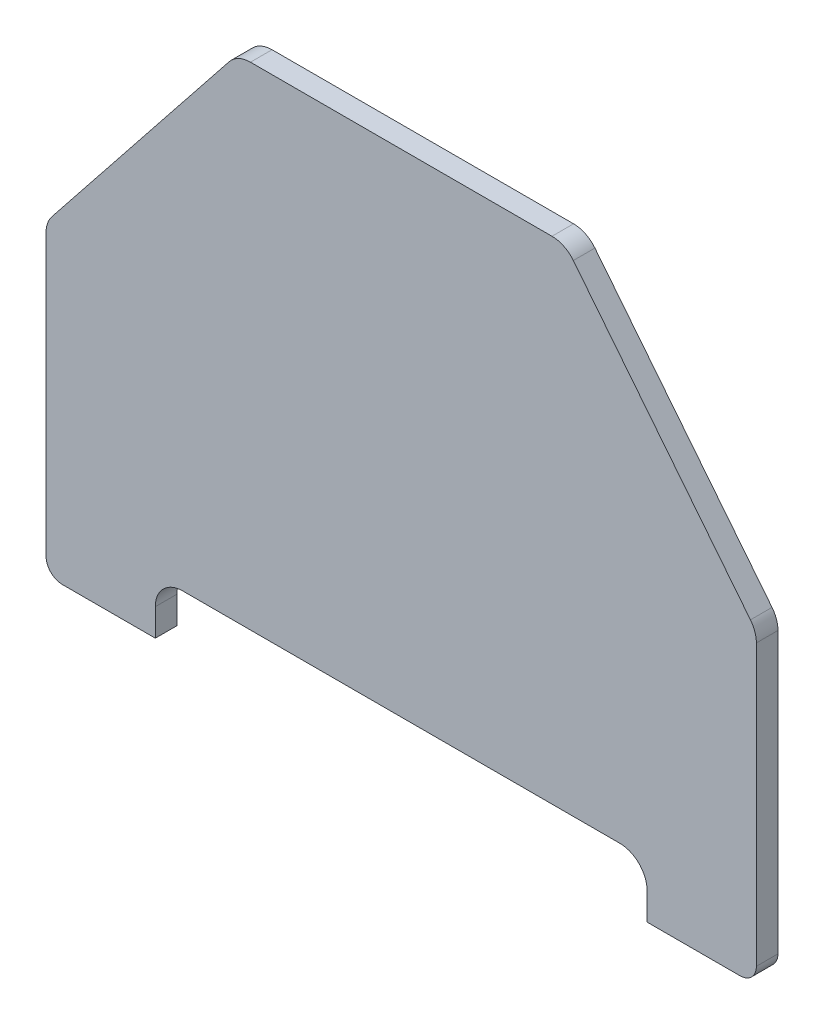
ISO-10303-21;
HEADER;
FILE_DESCRIPTION(('STEP AP214'),'2;1');
FILE_NAME('part.step','',(''),(''),'','','');
FILE_SCHEMA(('AUTOMOTIVE_DESIGN { 1 0 10303 214 1 1 1 1 }'));
ENDSEC;
DATA;
#1=APPLICATION_CONTEXT('core data for automotive mechanical design processes');
#2=APPLICATION_PROTOCOL_DEFINITION('international standard','automotive_design',2000,#1);
#3=PRODUCT_CONTEXT('',#1,'mechanical');
#4=PRODUCT('Part','Part','',(#3));
#5=PRODUCT_RELATED_PRODUCT_CATEGORY('part','',(#4));
#6=PRODUCT_DEFINITION_FORMATION('','',#4);
#7=PRODUCT_DEFINITION_CONTEXT('part definition',#1,'design');
#8=PRODUCT_DEFINITION('design','',#6,#7);
#9=PRODUCT_DEFINITION_SHAPE('','',#8);
#10=(LENGTH_UNIT() NAMED_UNIT(*) SI_UNIT(.MILLI.,.METRE.));
#11=(NAMED_UNIT(*) PLANE_ANGLE_UNIT() SI_UNIT($,.RADIAN.));
#12=(NAMED_UNIT(*) SI_UNIT($,.STERADIAN.) SOLID_ANGLE_UNIT());
#13=UNCERTAINTY_MEASURE_WITH_UNIT(LENGTH_MEASURE(1.E-05),#10,'distance_accuracy_value','');
#14=(GEOMETRIC_REPRESENTATION_CONTEXT(3) GLOBAL_UNCERTAINTY_ASSIGNED_CONTEXT((#13)) GLOBAL_UNIT_ASSIGNED_CONTEXT((#10,
#11,#12)) REPRESENTATION_CONTEXT('',''));
#15=CARTESIAN_POINT('',(0.,0.,0.));
#16=DIRECTION('',(0.,0.,1.));
#17=DIRECTION('',(1.,0.,0.));
#18=AXIS2_PLACEMENT_3D('',#15,#16,#17);
#19=CARTESIAN_POINT('',(110.,0.,3.95));
#20=DIRECTION('',(0.,1.,0.));
#21=DIRECTION('',(0.,0.,1.));
#22=AXIS2_PLACEMENT_3D('',#19,#20,#21);
#23=PLANE('',#22);
#24=DIRECTION('',(1.,0.,0.));
#25=VECTOR('',#24,1.);
#26=CARTESIAN_POINT('',(110.,0.,0.));
#27=LINE('',#26,#25);
#28=CARTESIAN_POINT('',(110.,0.,0.));
#29=VERTEX_POINT('',#28);
#30=CARTESIAN_POINT('',(127.,0.,0.));
#31=VERTEX_POINT('',#30);
#32=EDGE_CURVE('E194',#29,#31,#27,.T.);
#33=ORIENTED_EDGE('',*,*,#32,.T.);
#34=DIRECTION('',(0.,0.,-1.));
#35=VECTOR('',#34,1.);
#36=CARTESIAN_POINT('',(127.,0.,3.95));
#37=LINE('',#36,#35);
#38=CARTESIAN_POINT('',(127.,0.,3.95));
#39=VERTEX_POINT('',#38);
#40=EDGE_CURVE('E282',#31,#39,#37,.F.);
#41=ORIENTED_EDGE('',*,*,#40,.T.);
#42=DIRECTION('',(1.,0.,0.));
#43=VECTOR('',#42,1.);
#44=CARTESIAN_POINT('',(110.,0.,3.95));
#45=LINE('',#44,#43);
#46=CARTESIAN_POINT('',(110.,0.,3.95));
#47=VERTEX_POINT('',#46);
#48=EDGE_CURVE('E218',#47,#39,#45,.T.);
#49=ORIENTED_EDGE('',*,*,#48,.F.);
#50=DIRECTION('',(0.,0.,-1.));
#51=VECTOR('',#50,1.);
#52=CARTESIAN_POINT('',(110.,0.,3.95));
#53=LINE('',#52,#51);
#54=EDGE_CURVE('E181',#47,#29,#53,.T.);
#55=ORIENTED_EDGE('',*,*,#54,.T.);
#56=EDGE_LOOP('',(#33,#41,#49,#55));
#57=FACE_BOUND('',#56,.T.);
#58=ADVANCED_FACE('F37',(#57),#23,.F.);
#59=CARTESIAN_POINT('',(130.,56.,3.95));
#60=DIRECTION('',(-1.,0.,0.));
#61=DIRECTION('',(0.,0.,1.));
#62=AXIS2_PLACEMENT_3D('',#59,#60,#61);
#63=PLANE('',#62);
#64=DIRECTION('',(0.,1.,0.));
#65=VECTOR('',#64,1.);
#66=CARTESIAN_POINT('',(130.,56.,3.95));
#67=LINE('',#66,#65);
#68=CARTESIAN_POINT('',(130.,3.,3.95));
#69=VERTEX_POINT('',#68);
#70=CARTESIAN_POINT('',(130.,54.2538898303597,3.95));
#71=VERTEX_POINT('',#70);
#72=EDGE_CURVE('E313',#69,#71,#67,.T.);
#73=ORIENTED_EDGE('',*,*,#72,.F.);
#74=DIRECTION('',(0.,0.,-1.));
#75=VECTOR('',#74,1.);
#76=CARTESIAN_POINT('',(130.,3.,3.95));
#77=LINE('',#76,#75);
#78=CARTESIAN_POINT('',(130.,3.,0.));
#79=VERTEX_POINT('',#78);
#80=EDGE_CURVE('E275',#69,#79,#77,.T.);
#81=ORIENTED_EDGE('',*,*,#80,.T.);
#82=DIRECTION('',(0.,1.,0.));
#83=VECTOR('',#82,1.);
#84=CARTESIAN_POINT('',(130.,56.,0.));
#85=LINE('',#84,#83);
#86=CARTESIAN_POINT('',(130.,54.2538898303597,0.));
#87=VERTEX_POINT('',#86);
#88=EDGE_CURVE('E197',#79,#87,#85,.T.);
#89=ORIENTED_EDGE('',*,*,#88,.T.);
#90=DIRECTION('',(0.,0.,-1.));
#91=VECTOR('',#90,1.);
#92=CARTESIAN_POINT('',(130.,54.2538898303597,3.95));
#93=LINE('',#92,#91);
#94=EDGE_CURVE('E234',#87,#71,#93,.F.);
#95=ORIENTED_EDGE('',*,*,#94,.T.);
#96=EDGE_LOOP('',(#73,#81,#89,#95));
#97=FACE_BOUND('',#96,.T.);
#98=ADVANCED_FACE('F334',(#97),#63,.F.);
#99=CARTESIAN_POINT('',(95.,100.,3.95));
#100=DIRECTION('',(-0.782601054175649,-0.622523565821539,0.));
#101=DIRECTION('',(0.622523565821539,-0.782601054175649,0.));
#102=AXIS2_PLACEMENT_3D('',#99,#100,#101);
#103=PLANE('',#102);
#104=DIRECTION('',(-0.622523565821539,0.782601054175649,0.));
#105=VECTOR('',#104,1.);
#106=CARTESIAN_POINT('',(95.,100.,3.95));
#107=LINE('',#106,#105);
#108=CARTESIAN_POINT('',(128.913005270878,57.3665076594673,3.95));
#109=VERTEX_POINT('',#108);
#110=CARTESIAN_POINT('',(96.5013267268461,98.1126178291077,3.95));
#111=VERTEX_POINT('',#110);
#112=EDGE_CURVE('E315',#109,#111,#107,.T.);
#113=ORIENTED_EDGE('',*,*,#112,.F.);
#114=DIRECTION('',(0.,0.,-1.));
#115=VECTOR('',#114,1.);
#116=CARTESIAN_POINT('',(128.913005270878,57.3665076594673,3.95));
#117=LINE('',#116,#115);
#118=CARTESIAN_POINT('',(128.913005270878,57.3665076594673,0.));
#119=VERTEX_POINT('',#118);
#120=EDGE_CURVE('E222',#109,#119,#117,.T.);
#121=ORIENTED_EDGE('',*,*,#120,.T.);
#122=DIRECTION('',(-0.622523565821539,0.782601054175649,0.));
#123=VECTOR('',#122,1.);
#124=CARTESIAN_POINT('',(95.,100.,0.));
#125=LINE('',#124,#123);
#126=CARTESIAN_POINT('',(96.5013267268461,98.1126178291077,0.));
#127=VERTEX_POINT('',#126);
#128=EDGE_CURVE('E199',#119,#127,#125,.T.);
#129=ORIENTED_EDGE('',*,*,#128,.T.);
#130=DIRECTION('',(0.,0.,-1.));
#131=VECTOR('',#130,1.);
#132=CARTESIAN_POINT('',(96.5013267268461,98.1126178291077,3.95));
#133=LINE('',#132,#131);
#134=EDGE_CURVE('E180',#127,#111,#133,.F.);
#135=ORIENTED_EDGE('',*,*,#134,.T.);
#136=EDGE_LOOP('',(#113,#121,#129,#135));
#137=FACE_BOUND('',#136,.T.);
#138=ADVANCED_FACE('F339',(#137),#103,.F.);
#139=CARTESIAN_POINT('',(35.,100.,3.95));
#140=DIRECTION('',(0.,-1.,0.));
#141=DIRECTION('',(0.,0.,-1.));
#142=AXIS2_PLACEMENT_3D('',#139,#140,#141);
#143=PLANE('',#142);
#144=DIRECTION('',(-1.,0.,0.));
#145=VECTOR('',#144,1.);
#146=CARTESIAN_POINT('',(35.,100.,3.95));
#147=LINE('',#146,#145);
#148=CARTESIAN_POINT('',(92.5883214559679,100.,3.95));
#149=VERTEX_POINT('',#148);
#150=CARTESIAN_POINT('',(37.4116785440321,100.,3.95));
#151=VERTEX_POINT('',#150);
#152=EDGE_CURVE('E320',#149,#151,#147,.T.);
#153=ORIENTED_EDGE('',*,*,#152,.F.);
#154=DIRECTION('',(0.,0.,-1.));
#155=VECTOR('',#154,1.);
#156=CARTESIAN_POINT('',(92.5883214559679,100.,3.95));
#157=LINE('',#156,#155);
#158=CARTESIAN_POINT('',(92.5883214559679,100.,0.));
#159=VERTEX_POINT('',#158);
#160=EDGE_CURVE('E247',#149,#159,#157,.T.);
#161=ORIENTED_EDGE('',*,*,#160,.T.);
#162=DIRECTION('',(-1.,0.,0.));
#163=VECTOR('',#162,1.);
#164=CARTESIAN_POINT('',(35.,100.,0.));
#165=LINE('',#164,#163);
#166=CARTESIAN_POINT('',(37.4116785440321,100.,0.));
#167=VERTEX_POINT('',#166);
#168=EDGE_CURVE('E202',#159,#167,#165,.T.);
#169=ORIENTED_EDGE('',*,*,#168,.T.);
#170=DIRECTION('',(0.,0.,-1.));
#171=VECTOR('',#170,1.);
#172=CARTESIAN_POINT('',(37.4116785440321,100.,3.95));
#173=LINE('',#172,#171);
#174=EDGE_CURVE('E245',#167,#151,#173,.F.);
#175=ORIENTED_EDGE('',*,*,#174,.T.);
#176=EDGE_LOOP('',(#153,#161,#169,#175));
#177=FACE_BOUND('',#176,.T.);
#178=ADVANCED_FACE('F435',(#177),#143,.F.);
#179=CARTESIAN_POINT('',(0.,56.,3.95));
#180=DIRECTION('',(0.782601054175649,-0.622523565821539,0.));
#181=DIRECTION('',(0.622523565821539,0.782601054175649,0.));
#182=AXIS2_PLACEMENT_3D('',#179,#180,#181);
#183=PLANE('',#182);
#184=DIRECTION('',(-0.622523565821539,-0.782601054175649,0.));
#185=VECTOR('',#184,1.);
#186=CARTESIAN_POINT('',(0.,56.,3.95));
#187=LINE('',#186,#185);
#188=CARTESIAN_POINT('',(33.4986732731538,98.1126178291077,3.95));
#189=VERTEX_POINT('',#188);
#190=CARTESIAN_POINT('',(1.08699472912176,57.3665076594674,3.95));
#191=VERTEX_POINT('',#190);
#192=EDGE_CURVE('E323',#189,#191,#187,.T.);
#193=ORIENTED_EDGE('',*,*,#192,.F.);
#194=DIRECTION('',(0.,0.,-1.));
#195=VECTOR('',#194,1.);
#196=CARTESIAN_POINT('',(33.4986732731538,98.1126178291077,3.95));
#197=LINE('',#196,#195);
#198=CARTESIAN_POINT('',(33.4986732731538,98.1126178291077,0.));
#199=VERTEX_POINT('',#198);
#200=EDGE_CURVE('E252',#189,#199,#197,.T.);
#201=ORIENTED_EDGE('',*,*,#200,.T.);
#202=DIRECTION('',(-0.622523565821539,-0.782601054175649,0.));
#203=VECTOR('',#202,1.);
#204=CARTESIAN_POINT('',(0.,56.,0.));
#205=LINE('',#204,#203);
#206=CARTESIAN_POINT('',(1.08699472912176,57.3665076594674,0.));
#207=VERTEX_POINT('',#206);
#208=EDGE_CURVE('E205',#199,#207,#205,.T.);
#209=ORIENTED_EDGE('',*,*,#208,.T.);
#210=DIRECTION('',(0.,0.,-1.));
#211=VECTOR('',#210,1.);
#212=CARTESIAN_POINT('',(1.08699472912176,57.3665076594674,3.95));
#213=LINE('',#212,#211);
#214=EDGE_CURVE('E250',#207,#191,#213,.F.);
#215=ORIENTED_EDGE('',*,*,#214,.T.);
#216=EDGE_LOOP('',(#193,#201,#209,#215));
#217=FACE_BOUND('',#216,.T.);
#218=ADVANCED_FACE('F414',(#217),#183,.F.);
#219=CARTESIAN_POINT('',(0.,56.,3.95));
#220=DIRECTION('',(1.,0.,0.));
#221=DIRECTION('',(0.,1.,0.));
#222=AXIS2_PLACEMENT_3D('',#219,#220,#221);
#223=PLANE('',#222);
#224=DIRECTION('',(0.,-1.,0.));
#225=VECTOR('',#224,1.);
#226=CARTESIAN_POINT('',(0.,56.,0.));
#227=LINE('',#226,#225);
#228=CARTESIAN_POINT('',(0.,54.2538898303597,0.));
#229=VERTEX_POINT('',#228);
#230=CARTESIAN_POINT('',(0.,3.,0.));
#231=VERTEX_POINT('',#230);
#232=EDGE_CURVE('E208',#229,#231,#227,.T.);
#233=ORIENTED_EDGE('',*,*,#232,.T.);
#234=DIRECTION('',(0.,0.,-1.));
#235=VECTOR('',#234,1.);
#236=CARTESIAN_POINT('',(0.,3.,3.95));
#237=LINE('',#236,#235);
#238=CARTESIAN_POINT('',(0.,3.,3.95));
#239=VERTEX_POINT('',#238);
#240=EDGE_CURVE('E11',#231,#239,#237,.F.);
#241=ORIENTED_EDGE('',*,*,#240,.T.);
#242=DIRECTION('',(0.,-1.,0.));
#243=VECTOR('',#242,1.);
#244=CARTESIAN_POINT('',(0.,56.,3.95));
#245=LINE('',#244,#243);
#246=CARTESIAN_POINT('',(0.,54.2538898303597,3.95));
#247=VERTEX_POINT('',#246);
#248=EDGE_CURVE('E170',#247,#239,#245,.T.);
#249=ORIENTED_EDGE('',*,*,#248,.F.);
#250=DIRECTION('',(0.,0.,-1.));
#251=VECTOR('',#250,1.);
#252=CARTESIAN_POINT('',(0.,54.2538898303597,3.95));
#253=LINE('',#252,#251);
#254=EDGE_CURVE('E255',#247,#229,#253,.T.);
#255=ORIENTED_EDGE('',*,*,#254,.T.);
#256=EDGE_LOOP('',(#233,#241,#249,#255));
#257=FACE_BOUND('',#256,.T.);
#258=ADVANCED_FACE('F403',(#257),#223,.F.);
#259=CARTESIAN_POINT('',(0.,0.,3.95));
#260=DIRECTION('',(0.,1.,0.));
#261=DIRECTION('',(0.,0.,1.));
#262=AXIS2_PLACEMENT_3D('',#259,#260,#261);
#263=PLANE('',#262);
#264=DIRECTION('',(1.,0.,0.));
#265=VECTOR('',#264,1.);
#266=CARTESIAN_POINT('',(0.,0.,3.95));
#267=LINE('',#266,#265);
#268=CARTESIAN_POINT('',(3.,0.,3.95));
#269=VERTEX_POINT('',#268);
#270=CARTESIAN_POINT('',(20.,0.,3.95));
#271=VERTEX_POINT('',#270);
#272=EDGE_CURVE('E160',#269,#271,#267,.T.);
#273=ORIENTED_EDGE('',*,*,#272,.F.);
#274=DIRECTION('',(0.,0.,-1.));
#275=VECTOR('',#274,1.);
#276=CARTESIAN_POINT('',(3.,0.,3.95));
#277=LINE('',#276,#275);
#278=CARTESIAN_POINT('',(3.,0.,0.));
#279=VERTEX_POINT('',#278);
#280=EDGE_CURVE('E45',#269,#279,#277,.T.);
#281=ORIENTED_EDGE('',*,*,#280,.T.);
#282=DIRECTION('',(1.,0.,0.));
#283=VECTOR('',#282,1.);
#284=CARTESIAN_POINT('',(0.,0.,0.));
#285=LINE('',#284,#283);
#286=CARTESIAN_POINT('',(20.,0.,0.));
#287=VERTEX_POINT('',#286);
#288=EDGE_CURVE('E176',#279,#287,#285,.T.);
#289=ORIENTED_EDGE('',*,*,#288,.T.);
#290=DIRECTION('',(0.,0.,-1.));
#291=VECTOR('',#290,1.);
#292=CARTESIAN_POINT('',(20.,0.,3.95));
#293=LINE('',#292,#291);
#294=EDGE_CURVE('E173',#271,#287,#293,.T.);
#295=ORIENTED_EDGE('',*,*,#294,.F.);
#296=EDGE_LOOP('',(#273,#281,#289,#295));
#297=FACE_BOUND('',#296,.T.);
#298=ADVANCED_FACE('F174',(#297),#263,.F.);
#299=CARTESIAN_POINT('',(20.,0.,3.95));
#300=DIRECTION('',(-1.,0.,0.));
#301=DIRECTION('',(0.,-1.,0.));
#302=AXIS2_PLACEMENT_3D('',#299,#300,#301);
#303=PLANE('',#302);
#304=DIRECTION('',(0.,1.,0.));
#305=VECTOR('',#304,1.);
#306=CARTESIAN_POINT('',(20.,0.,0.));
#307=LINE('',#306,#305);
#308=CARTESIAN_POINT('',(20.,5.,0.));
#309=VERTEX_POINT('',#308);
#310=EDGE_CURVE('E211',#287,#309,#307,.T.);
#311=ORIENTED_EDGE('',*,*,#310,.T.);
#312=DIRECTION('',(0.,0.,-1.));
#313=VECTOR('',#312,1.);
#314=CARTESIAN_POINT('',(20.,5.,3.95));
#315=LINE('',#314,#313);
#316=CARTESIAN_POINT('',(20.,5.,3.95));
#317=VERTEX_POINT('',#316);
#318=EDGE_CURVE('E185',#309,#317,#315,.F.);
#319=ORIENTED_EDGE('',*,*,#318,.T.);
#320=DIRECTION('',(0.,1.,0.));
#321=VECTOR('',#320,1.);
#322=CARTESIAN_POINT('',(20.,0.,3.95));
#323=LINE('',#322,#321);
#324=EDGE_CURVE('E165',#271,#317,#323,.T.);
#325=ORIENTED_EDGE('',*,*,#324,.F.);
#326=ORIENTED_EDGE('',*,*,#294,.T.);
#327=EDGE_LOOP('',(#311,#319,#325,#326));
#328=FACE_BOUND('',#327,.T.);
#329=ADVANCED_FACE('F183',(#328),#303,.F.);
#330=CARTESIAN_POINT('',(20.,10.,3.95));
#331=DIRECTION('',(0.,1.,0.));
#332=DIRECTION('',(0.,0.,1.));
#333=AXIS2_PLACEMENT_3D('',#330,#331,#332);
#334=PLANE('',#333);
#335=DIRECTION('',(1.,0.,0.));
#336=VECTOR('',#335,1.);
#337=CARTESIAN_POINT('',(20.,10.,0.));
#338=LINE('',#337,#336);
#339=CARTESIAN_POINT('',(25.,10.,0.));
#340=VERTEX_POINT('',#339);
#341=CARTESIAN_POINT('',(105.,10.,0.));
#342=VERTEX_POINT('',#341);
#343=EDGE_CURVE('E213',#340,#342,#338,.T.);
#344=ORIENTED_EDGE('',*,*,#343,.T.);
#345=DIRECTION('',(0.,0.,-1.));
#346=VECTOR('',#345,1.);
#347=CARTESIAN_POINT('',(105.,10.,3.95));
#348=LINE('',#347,#346);
#349=CARTESIAN_POINT('',(105.,10.,3.95));
#350=VERTEX_POINT('',#349);
#351=EDGE_CURVE('E264',#342,#350,#348,.F.);
#352=ORIENTED_EDGE('',*,*,#351,.T.);
#353=DIRECTION('',(1.,0.,0.));
#354=VECTOR('',#353,1.);
#355=CARTESIAN_POINT('',(20.,10.,3.95));
#356=LINE('',#355,#354);
#357=CARTESIAN_POINT('',(25.,10.,3.95));
#358=VERTEX_POINT('',#357);
#359=EDGE_CURVE('E186',#358,#350,#356,.T.);
#360=ORIENTED_EDGE('',*,*,#359,.F.);
#361=DIRECTION('',(0.,0.,-1.));
#362=VECTOR('',#361,1.);
#363=CARTESIAN_POINT('',(25.,10.,0.));
#364=LINE('',#363,#362);
#365=EDGE_CURVE('E261',#358,#340,#364,.T.);
#366=ORIENTED_EDGE('',*,*,#365,.T.);
#367=EDGE_LOOP('',(#344,#352,#360,#366));
#368=FACE_BOUND('',#367,.T.);
#369=ADVANCED_FACE('F298',(#368),#334,.F.);
#370=CARTESIAN_POINT('',(110.,0.,3.95));
#371=DIRECTION('',(1.,0.,0.));
#372=DIRECTION('',(0.,0.,-1.));
#373=AXIS2_PLACEMENT_3D('',#370,#371,#372);
#374=PLANE('',#373);
#375=DIRECTION('',(0.,-1.,0.));
#376=VECTOR('',#375,1.);
#377=CARTESIAN_POINT('',(110.,0.,3.95));
#378=LINE('',#377,#376);
#379=CARTESIAN_POINT('',(110.,5.,3.95));
#380=VERTEX_POINT('',#379);
#381=EDGE_CURVE('E189',#380,#47,#378,.T.);
#382=ORIENTED_EDGE('',*,*,#381,.F.);
#383=DIRECTION('',(0.,0.,-1.));
#384=VECTOR('',#383,1.);
#385=CARTESIAN_POINT('',(110.,5.,0.));
#386=LINE('',#385,#384);
#387=CARTESIAN_POINT('',(110.,5.,0.));
#388=VERTEX_POINT('',#387);
#389=EDGE_CURVE('E258',#380,#388,#386,.T.);
#390=ORIENTED_EDGE('',*,*,#389,.T.);
#391=DIRECTION('',(0.,-1.,0.));
#392=VECTOR('',#391,1.);
#393=CARTESIAN_POINT('',(110.,0.,0.));
#394=LINE('',#393,#392);
#395=EDGE_CURVE('E216',#388,#29,#394,.T.);
#396=ORIENTED_EDGE('',*,*,#395,.T.);
#397=ORIENTED_EDGE('',*,*,#54,.F.);
#398=EDGE_LOOP('',(#382,#390,#396,#397));
#399=FACE_BOUND('',#398,.T.);
#400=ADVANCED_FACE('F306',(#399),#374,.F.);
#401=CARTESIAN_POINT('',(0.,0.,3.95));
#402=DIRECTION('',(0.,0.,-1.));
#403=DIRECTION('',(-1.,0.,0.));
#404=AXIS2_PLACEMENT_3D('',#401,#402,#403);
#405=PLANE('',#404);
#406=ORIENTED_EDGE('',*,*,#48,.T.);
#407=CARTESIAN_POINT('',(127.,3.,3.95));
#408=DIRECTION('',(0.,0.,-1.));
#409=DIRECTION('',(-1.,0.,0.));
#410=AXIS2_PLACEMENT_3D('',#407,#408,#409);
#411=CIRCLE('',#410,3.);
#412=EDGE_CURVE('E285',#39,#69,#411,.F.);
#413=ORIENTED_EDGE('',*,*,#412,.T.);
#414=ORIENTED_EDGE('',*,*,#72,.T.);
#415=CARTESIAN_POINT('',(125.,54.2538898303597,3.95));
#416=DIRECTION('',(0.,0.,-1.));
#417=DIRECTION('',(-1.,0.,0.));
#418=AXIS2_PLACEMENT_3D('',#415,#416,#417);
#419=CIRCLE('',#418,5.);
#420=EDGE_CURVE('E243',#71,#109,#419,.F.);
#421=ORIENTED_EDGE('',*,*,#420,.T.);
#422=ORIENTED_EDGE('',*,*,#112,.T.);
#423=CARTESIAN_POINT('',(92.5883214559679,95.,3.95));
#424=DIRECTION('',(0.,0.,-1.));
#425=DIRECTION('',(-1.,0.,0.));
#426=AXIS2_PLACEMENT_3D('',#423,#424,#425);
#427=CIRCLE('',#426,5.);
#428=EDGE_CURVE('E241',#111,#149,#427,.F.);
#429=ORIENTED_EDGE('',*,*,#428,.T.);
#430=ORIENTED_EDGE('',*,*,#152,.T.);
#431=CARTESIAN_POINT('',(37.4116785440321,95.,3.95));
#432=DIRECTION('',(0.,0.,-1.));
#433=DIRECTION('',(-1.,0.,0.));
#434=AXIS2_PLACEMENT_3D('',#431,#432,#433);
#435=CIRCLE('',#434,5.);
#436=EDGE_CURVE('E239',#151,#189,#435,.F.);
#437=ORIENTED_EDGE('',*,*,#436,.T.);
#438=ORIENTED_EDGE('',*,*,#192,.T.);
#439=CARTESIAN_POINT('',(5.,54.2538898303597,3.95));
#440=DIRECTION('',(0.,0.,-1.));
#441=DIRECTION('',(-1.,0.,0.));
#442=AXIS2_PLACEMENT_3D('',#439,#440,#441);
#443=CIRCLE('',#442,5.);
#444=EDGE_CURVE('E237',#191,#247,#443,.F.);
#445=ORIENTED_EDGE('',*,*,#444,.T.);
#446=ORIENTED_EDGE('',*,*,#248,.T.);
#447=CARTESIAN_POINT('',(3.,3.,3.95));
#448=DIRECTION('',(0.,0.,-1.));
#449=DIRECTION('',(-1.,0.,0.));
#450=AXIS2_PLACEMENT_3D('',#447,#448,#449);
#451=CIRCLE('',#450,3.);
#452=EDGE_CURVE('E52',#239,#269,#451,.F.);
#453=ORIENTED_EDGE('',*,*,#452,.T.);
#454=ORIENTED_EDGE('',*,*,#272,.T.);
#455=ORIENTED_EDGE('',*,*,#324,.T.);
#456=CARTESIAN_POINT('',(25.,5.,3.95));
#457=DIRECTION('',(0.,0.,-1.));
#458=DIRECTION('',(-1.,0.,0.));
#459=AXIS2_PLACEMENT_3D('',#456,#457,#458);
#460=CIRCLE('',#459,5.);
#461=EDGE_CURVE('E273',#317,#358,#460,.T.);
#462=ORIENTED_EDGE('',*,*,#461,.T.);
#463=ORIENTED_EDGE('',*,*,#359,.T.);
#464=CARTESIAN_POINT('',(105.,5.,3.95));
#465=DIRECTION('',(0.,0.,-1.));
#466=DIRECTION('',(-1.,0.,0.));
#467=AXIS2_PLACEMENT_3D('',#464,#465,#466);
#468=CIRCLE('',#467,5.);
#469=EDGE_CURVE('E269',#350,#380,#468,.T.);
#470=ORIENTED_EDGE('',*,*,#469,.T.);
#471=ORIENTED_EDGE('',*,*,#381,.T.);
#472=EDGE_LOOP('',(#406,#413,#414,#421,#422,#429,#430,#437,#438,#445,#446,#453,#454,#455,#462,
#463,#470,#471));
#473=FACE_BOUND('',#472,.T.);
#474=ADVANCED_FACE('F163',(#473),#405,.F.);
#475=CARTESIAN_POINT('',(0.,0.,0.));
#476=DIRECTION('',(0.,0.,-1.));
#477=DIRECTION('',(-1.,0.,0.));
#478=AXIS2_PLACEMENT_3D('',#475,#476,#477);
#479=PLANE('',#478);
#480=ORIENTED_EDGE('',*,*,#88,.F.);
#481=CARTESIAN_POINT('',(127.,3.,0.));
#482=DIRECTION('',(0.,0.,-1.));
#483=DIRECTION('',(-1.,0.,0.));
#484=AXIS2_PLACEMENT_3D('',#481,#482,#483);
#485=CIRCLE('',#484,3.);
#486=EDGE_CURVE('E280',#79,#31,#485,.T.);
#487=ORIENTED_EDGE('',*,*,#486,.T.);
#488=ORIENTED_EDGE('',*,*,#32,.F.);
#489=ORIENTED_EDGE('',*,*,#395,.F.);
#490=CARTESIAN_POINT('',(105.,5.,0.));
#491=DIRECTION('',(0.,0.,-1.));
#492=DIRECTION('',(-1.,0.,0.));
#493=AXIS2_PLACEMENT_3D('',#490,#491,#492);
#494=CIRCLE('',#493,5.);
#495=EDGE_CURVE('E267',#388,#342,#494,.F.);
#496=ORIENTED_EDGE('',*,*,#495,.T.);
#497=ORIENTED_EDGE('',*,*,#343,.F.);
#498=CARTESIAN_POINT('',(25.,5.,0.));
#499=DIRECTION('',(0.,0.,-1.));
#500=DIRECTION('',(-1.,0.,0.));
#501=AXIS2_PLACEMENT_3D('',#498,#499,#500);
#502=CIRCLE('',#501,5.);
#503=EDGE_CURVE('E271',#340,#309,#502,.F.);
#504=ORIENTED_EDGE('',*,*,#503,.T.);
#505=ORIENTED_EDGE('',*,*,#310,.F.);
#506=ORIENTED_EDGE('',*,*,#288,.F.);
#507=CARTESIAN_POINT('',(3.,3.,0.));
#508=DIRECTION('',(0.,0.,-1.));
#509=DIRECTION('',(-1.,0.,0.));
#510=AXIS2_PLACEMENT_3D('',#507,#508,#509);
#511=CIRCLE('',#510,3.);
#512=EDGE_CURVE('E278',#279,#231,#511,.T.);
#513=ORIENTED_EDGE('',*,*,#512,.T.);
#514=ORIENTED_EDGE('',*,*,#232,.F.);
#515=CARTESIAN_POINT('',(5.,54.2538898303597,0.));
#516=DIRECTION('',(0.,0.,-1.));
#517=DIRECTION('',(-1.,0.,0.));
#518=AXIS2_PLACEMENT_3D('',#515,#516,#517);
#519=CIRCLE('',#518,5.);
#520=EDGE_CURVE('E225',#229,#207,#519,.T.);
#521=ORIENTED_EDGE('',*,*,#520,.T.);
#522=ORIENTED_EDGE('',*,*,#208,.F.);
#523=CARTESIAN_POINT('',(37.4116785440321,95.,0.));
#524=DIRECTION('',(0.,0.,-1.));
#525=DIRECTION('',(-1.,0.,0.));
#526=AXIS2_PLACEMENT_3D('',#523,#524,#525);
#527=CIRCLE('',#526,5.);
#528=EDGE_CURVE('E227',#199,#167,#527,.T.);
#529=ORIENTED_EDGE('',*,*,#528,.T.);
#530=ORIENTED_EDGE('',*,*,#168,.F.);
#531=CARTESIAN_POINT('',(92.5883214559679,95.,0.));
#532=DIRECTION('',(0.,0.,-1.));
#533=DIRECTION('',(-1.,0.,0.));
#534=AXIS2_PLACEMENT_3D('',#531,#532,#533);
#535=CIRCLE('',#534,5.);
#536=EDGE_CURVE('E229',#159,#127,#535,.T.);
#537=ORIENTED_EDGE('',*,*,#536,.T.);
#538=ORIENTED_EDGE('',*,*,#128,.F.);
#539=CARTESIAN_POINT('',(125.,54.2538898303597,0.));
#540=DIRECTION('',(0.,0.,-1.));
#541=DIRECTION('',(-1.,0.,0.));
#542=AXIS2_PLACEMENT_3D('',#539,#540,#541);
#543=CIRCLE('',#542,5.);
#544=EDGE_CURVE('E231',#119,#87,#543,.T.);
#545=ORIENTED_EDGE('',*,*,#544,.T.);
#546=EDGE_LOOP('',(#480,#487,#488,#489,#496,#497,#504,#505,#506,#513,#514,#521,#522,#529,#530,
#537,#538,#545));
#547=FACE_BOUND('',#546,.T.);
#548=ADVANCED_FACE('F289',(#547),#479,.T.);
#549=CARTESIAN_POINT('',(125.,54.2538898303597,3.95));
#550=DIRECTION('',(0.,0.,-1.));
#551=DIRECTION('',(-1.,0.,0.));
#552=AXIS2_PLACEMENT_3D('',#549,#550,#551);
#553=CYLINDRICAL_SURFACE('',#552,5.);
#554=ORIENTED_EDGE('',*,*,#420,.F.);
#555=ORIENTED_EDGE('',*,*,#94,.F.);
#556=ORIENTED_EDGE('',*,*,#544,.F.);
#557=ORIENTED_EDGE('',*,*,#120,.F.);
#558=EDGE_LOOP('',(#554,#555,#556,#557));
#559=FACE_BOUND('',#558,.T.);
#560=ADVANCED_FACE('F344',(#559),#553,.T.);
#561=CARTESIAN_POINT('',(92.5883214559679,95.,3.95));
#562=DIRECTION('',(0.,0.,-1.));
#563=DIRECTION('',(-1.,0.,0.));
#564=AXIS2_PLACEMENT_3D('',#561,#562,#563);
#565=CYLINDRICAL_SURFACE('',#564,5.);
#566=ORIENTED_EDGE('',*,*,#428,.F.);
#567=ORIENTED_EDGE('',*,*,#134,.F.);
#568=ORIENTED_EDGE('',*,*,#536,.F.);
#569=ORIENTED_EDGE('',*,*,#160,.F.);
#570=EDGE_LOOP('',(#566,#567,#568,#569));
#571=FACE_BOUND('',#570,.T.);
#572=ADVANCED_FACE('F347',(#571),#565,.T.);
#573=CARTESIAN_POINT('',(37.4116785440321,95.,3.95));
#574=DIRECTION('',(0.,0.,-1.));
#575=DIRECTION('',(-1.,0.,0.));
#576=AXIS2_PLACEMENT_3D('',#573,#574,#575);
#577=CYLINDRICAL_SURFACE('',#576,5.);
#578=ORIENTED_EDGE('',*,*,#436,.F.);
#579=ORIENTED_EDGE('',*,*,#174,.F.);
#580=ORIENTED_EDGE('',*,*,#528,.F.);
#581=ORIENTED_EDGE('',*,*,#200,.F.);
#582=EDGE_LOOP('',(#578,#579,#580,#581));
#583=FACE_BOUND('',#582,.T.);
#584=ADVANCED_FACE('F351',(#583),#577,.T.);
#585=CARTESIAN_POINT('',(5.,54.2538898303597,3.95));
#586=DIRECTION('',(0.,0.,-1.));
#587=DIRECTION('',(-1.,0.,0.));
#588=AXIS2_PLACEMENT_3D('',#585,#586,#587);
#589=CYLINDRICAL_SURFACE('',#588,5.);
#590=ORIENTED_EDGE('',*,*,#444,.F.);
#591=ORIENTED_EDGE('',*,*,#214,.F.);
#592=ORIENTED_EDGE('',*,*,#520,.F.);
#593=ORIENTED_EDGE('',*,*,#254,.F.);
#594=EDGE_LOOP('',(#590,#591,#592,#593));
#595=FACE_BOUND('',#594,.T.);
#596=ADVANCED_FACE('F355',(#595),#589,.T.);
#597=CARTESIAN_POINT('',(105.,5.,3.95));
#598=DIRECTION('',(0.,0.,1.));
#599=DIRECTION('',(1.,0.,0.));
#600=AXIS2_PLACEMENT_3D('',#597,#598,#599);
#601=CYLINDRICAL_SURFACE('',#600,5.);
#602=ORIENTED_EDGE('',*,*,#469,.F.);
#603=ORIENTED_EDGE('',*,*,#351,.F.);
#604=ORIENTED_EDGE('',*,*,#495,.F.);
#605=ORIENTED_EDGE('',*,*,#389,.F.);
#606=EDGE_LOOP('',(#602,#603,#604,#605));
#607=FACE_BOUND('',#606,.T.);
#608=ADVANCED_FACE('F301',(#607),#601,.F.);
#609=CARTESIAN_POINT('',(25.,5.,3.95));
#610=DIRECTION('',(0.,0.,1.));
#611=DIRECTION('',(1.,0.,0.));
#612=AXIS2_PLACEMENT_3D('',#609,#610,#611);
#613=CYLINDRICAL_SURFACE('',#612,5.);
#614=ORIENTED_EDGE('',*,*,#461,.F.);
#615=ORIENTED_EDGE('',*,*,#318,.F.);
#616=ORIENTED_EDGE('',*,*,#503,.F.);
#617=ORIENTED_EDGE('',*,*,#365,.F.);
#618=EDGE_LOOP('',(#614,#615,#616,#617));
#619=FACE_BOUND('',#618,.T.);
#620=ADVANCED_FACE('F293',(#619),#613,.F.);
#621=CARTESIAN_POINT('',(127.,3.,3.95));
#622=DIRECTION('',(0.,0.,-1.));
#623=DIRECTION('',(-1.,0.,0.));
#624=AXIS2_PLACEMENT_3D('',#621,#622,#623);
#625=CYLINDRICAL_SURFACE('',#624,3.);
#626=ORIENTED_EDGE('',*,*,#412,.F.);
#627=ORIENTED_EDGE('',*,*,#40,.F.);
#628=ORIENTED_EDGE('',*,*,#486,.F.);
#629=ORIENTED_EDGE('',*,*,#80,.F.);
#630=EDGE_LOOP('',(#626,#627,#628,#629));
#631=FACE_BOUND('',#630,.T.);
#632=ADVANCED_FACE('F328',(#631),#625,.T.);
#633=CARTESIAN_POINT('',(3.,3.,3.95));
#634=DIRECTION('',(0.,0.,-1.));
#635=DIRECTION('',(-1.,0.,0.));
#636=AXIS2_PLACEMENT_3D('',#633,#634,#635);
#637=CYLINDRICAL_SURFACE('',#636,3.);
#638=ORIENTED_EDGE('',*,*,#452,.F.);
#639=ORIENTED_EDGE('',*,*,#240,.F.);
#640=ORIENTED_EDGE('',*,*,#512,.F.);
#641=ORIENTED_EDGE('',*,*,#280,.F.);
#642=EDGE_LOOP('',(#638,#639,#640,#641));
#643=FACE_BOUND('',#642,.T.);
#644=ADVANCED_FACE('F39',(#643),#637,.T.);
#645=CLOSED_SHELL('',(#58,#98,#138,#178,#218,#258,#298,#329,#369,#400,#474,#548,#560,#572,#584,
#596,#608,#620,#632,#644));
#646=MANIFOLD_SOLID_BREP('B2',#645);
#647=ADVANCED_BREP_SHAPE_REPRESENTATION('',(#18,#646),#14);
#648=SHAPE_DEFINITION_REPRESENTATION(#9,#647);
ENDSEC;
END-ISO-10303-21;
